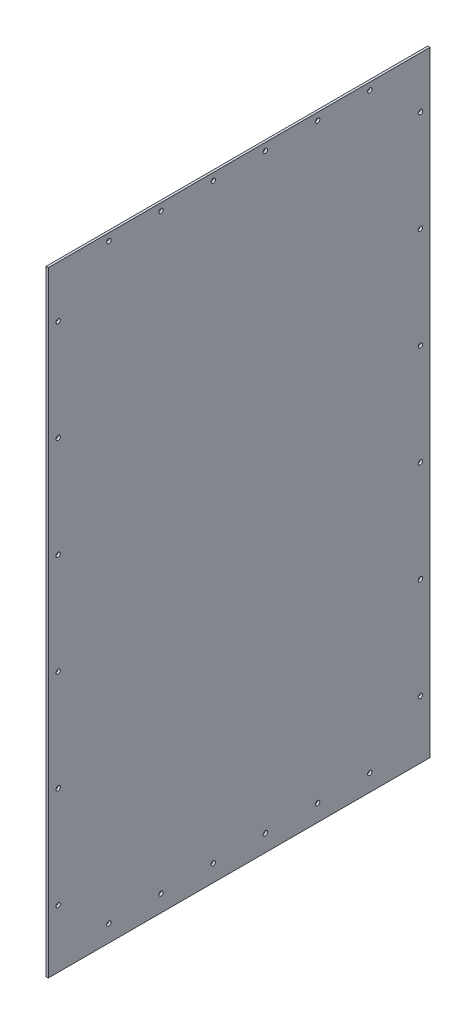
ISO-10303-21;
HEADER;
FILE_DESCRIPTION(('STEP AP214'),'2;1');
FILE_NAME('part.step','',(''),(''),'','','');
FILE_SCHEMA(('AUTOMOTIVE_DESIGN { 1 0 10303 214 1 1 1 1 }'));
ENDSEC;
DATA;
#1=APPLICATION_CONTEXT('core data for automotive mechanical design processes');
#2=APPLICATION_PROTOCOL_DEFINITION('international standard','automotive_design',2000,#1);
#3=PRODUCT_CONTEXT('',#1,'mechanical');
#4=PRODUCT('Part','Part','',(#3));
#5=PRODUCT_RELATED_PRODUCT_CATEGORY('part','',(#4));
#6=PRODUCT_DEFINITION_FORMATION('','',#4);
#7=PRODUCT_DEFINITION_CONTEXT('part definition',#1,'design');
#8=PRODUCT_DEFINITION('design','',#6,#7);
#9=PRODUCT_DEFINITION_SHAPE('','',#8);
#10=(LENGTH_UNIT() NAMED_UNIT(*) SI_UNIT(.MILLI.,.METRE.));
#11=(NAMED_UNIT(*) PLANE_ANGLE_UNIT() SI_UNIT($,.RADIAN.));
#12=(NAMED_UNIT(*) SI_UNIT($,.STERADIAN.) SOLID_ANGLE_UNIT());
#13=UNCERTAINTY_MEASURE_WITH_UNIT(LENGTH_MEASURE(1.E-05),#10,'distance_accuracy_value','');
#14=(GEOMETRIC_REPRESENTATION_CONTEXT(3) GLOBAL_UNCERTAINTY_ASSIGNED_CONTEXT((#13)) GLOBAL_UNIT_ASSIGNED_CONTEXT((#10,
#11,#12)) REPRESENTATION_CONTEXT('',''));
#15=CARTESIAN_POINT('',(0.,0.,0.));
#16=DIRECTION('',(0.,0.,1.));
#17=DIRECTION('',(1.,0.,0.));
#18=AXIS2_PLACEMENT_3D('',#15,#16,#17);
#19=CARTESIAN_POINT('',(0.,-328.2315,238.208299808));
#20=DIRECTION('',(1.,0.,0.));
#21=DIRECTION('',(0.,0.,-1.));
#22=AXIS2_PLACEMENT_3D('',#19,#20,#21);
#23=CYLINDRICAL_SURFACE('',#22,2.8956);
#24=CARTESIAN_POINT('',(0.,-328.2315,238.208299808));
#25=DIRECTION('',(1.,0.,0.));
#26=DIRECTION('',(0.,0.,-1.));
#27=AXIS2_PLACEMENT_3D('',#24,#25,#26);
#28=CIRCLE('',#27,2.8956);
#29=CARTESIAN_POINT('',(0.,-328.2315,235.312699808));
#30=VERTEX_POINT('',#29);
#31=EDGE_CURVE('E41',#30,#30,#28,.T.);
#32=ORIENTED_EDGE('',*,*,#31,.F.);
#33=EDGE_LOOP('',(#32));
#34=FACE_BOUND('',#33,.T.);
#35=CARTESIAN_POINT('',(3.0734,-328.2315,238.208299808));
#36=DIRECTION('',(1.,0.,0.));
#37=DIRECTION('',(0.,0.,-1.));
#38=AXIS2_PLACEMENT_3D('',#35,#36,#37);
#39=CIRCLE('',#38,2.8956);
#40=CARTESIAN_POINT('',(3.0734,-328.2315,235.312699808));
#41=VERTEX_POINT('',#40);
#42=EDGE_CURVE('E11',#41,#41,#39,.T.);
#43=ORIENTED_EDGE('',*,*,#42,.T.);
#44=EDGE_LOOP('',(#43));
#45=FACE_BOUND('',#44,.T.);
#46=ADVANCED_FACE('F33',(#34,#45),#23,.F.);
#47=CARTESIAN_POINT('',(0.,-195.09486,238.208299808));
#48=DIRECTION('',(1.,0.,0.));
#49=DIRECTION('',(0.,0.,-1.));
#50=AXIS2_PLACEMENT_3D('',#47,#48,#49);
#51=CYLINDRICAL_SURFACE('',#50,2.8956);
#52=CARTESIAN_POINT('',(0.,-195.09486,238.208299808));
#53=DIRECTION('',(1.,0.,0.));
#54=DIRECTION('',(0.,0.,-1.));
#55=AXIS2_PLACEMENT_3D('',#52,#53,#54);
#56=CIRCLE('',#55,2.8956);
#57=CARTESIAN_POINT('',(0.,-195.09486,235.312699808));
#58=VERTEX_POINT('',#57);
#59=EDGE_CURVE('E195',#58,#58,#56,.T.);
#60=ORIENTED_EDGE('',*,*,#59,.F.);
#61=EDGE_LOOP('',(#60));
#62=FACE_BOUND('',#61,.T.);
#63=CARTESIAN_POINT('',(3.0734,-195.09486,238.208299808));
#64=DIRECTION('',(1.,0.,0.));
#65=DIRECTION('',(0.,0.,-1.));
#66=AXIS2_PLACEMENT_3D('',#63,#64,#65);
#67=CIRCLE('',#66,2.8956);
#68=CARTESIAN_POINT('',(3.0734,-195.09486,235.312699808));
#69=VERTEX_POINT('',#68);
#70=EDGE_CURVE('E198',#69,#69,#67,.T.);
#71=ORIENTED_EDGE('',*,*,#70,.T.);
#72=EDGE_LOOP('',(#71));
#73=FACE_BOUND('',#72,.T.);
#74=ADVANCED_FACE('F207',(#62,#73),#51,.F.);
#75=CARTESIAN_POINT('',(0.,-61.95822,238.208299808));
#76=DIRECTION('',(1.,0.,0.));
#77=DIRECTION('',(0.,0.,-1.));
#78=AXIS2_PLACEMENT_3D('',#75,#76,#77);
#79=CYLINDRICAL_SURFACE('',#78,2.8956);
#80=CARTESIAN_POINT('',(0.,-61.95822,238.208299808));
#81=DIRECTION('',(1.,0.,0.));
#82=DIRECTION('',(0.,0.,-1.));
#83=AXIS2_PLACEMENT_3D('',#80,#81,#82);
#84=CIRCLE('',#83,2.8956);
#85=CARTESIAN_POINT('',(0.,-61.95822,235.312699808));
#86=VERTEX_POINT('',#85);
#87=EDGE_CURVE('E189',#86,#86,#84,.T.);
#88=ORIENTED_EDGE('',*,*,#87,.F.);
#89=EDGE_LOOP('',(#88));
#90=FACE_BOUND('',#89,.T.);
#91=CARTESIAN_POINT('',(3.0734,-61.95822,238.208299808));
#92=DIRECTION('',(1.,0.,0.));
#93=DIRECTION('',(0.,0.,-1.));
#94=AXIS2_PLACEMENT_3D('',#91,#92,#93);
#95=CIRCLE('',#94,2.8956);
#96=CARTESIAN_POINT('',(3.0734,-61.95822,235.312699808));
#97=VERTEX_POINT('',#96);
#98=EDGE_CURVE('E192',#97,#97,#95,.T.);
#99=ORIENTED_EDGE('',*,*,#98,.T.);
#100=EDGE_LOOP('',(#99));
#101=FACE_BOUND('',#100,.T.);
#102=ADVANCED_FACE('F286',(#90,#101),#79,.F.);
#103=CARTESIAN_POINT('',(0.,71.1784199999999,238.208299808));
#104=DIRECTION('',(1.,0.,0.));
#105=DIRECTION('',(0.,0.,-1.));
#106=AXIS2_PLACEMENT_3D('',#103,#104,#105);
#107=CYLINDRICAL_SURFACE('',#106,2.8956);
#108=CARTESIAN_POINT('',(0.,71.1784199999999,238.208299808));
#109=DIRECTION('',(1.,0.,0.));
#110=DIRECTION('',(0.,0.,-1.));
#111=AXIS2_PLACEMENT_3D('',#108,#109,#110);
#112=CIRCLE('',#111,2.8956);
#113=CARTESIAN_POINT('',(0.,71.1784199999999,235.312699808));
#114=VERTEX_POINT('',#113);
#115=EDGE_CURVE('E183',#114,#114,#112,.T.);
#116=ORIENTED_EDGE('',*,*,#115,.F.);
#117=EDGE_LOOP('',(#116));
#118=FACE_BOUND('',#117,.T.);
#119=CARTESIAN_POINT('',(3.0734,71.1784199999999,238.208299808));
#120=DIRECTION('',(1.,0.,0.));
#121=DIRECTION('',(0.,0.,-1.));
#122=AXIS2_PLACEMENT_3D('',#119,#120,#121);
#123=CIRCLE('',#122,2.8956);
#124=CARTESIAN_POINT('',(3.0734,71.1784199999999,235.312699808));
#125=VERTEX_POINT('',#124);
#126=EDGE_CURVE('E186',#125,#125,#123,.T.);
#127=ORIENTED_EDGE('',*,*,#126,.T.);
#128=EDGE_LOOP('',(#127));
#129=FACE_BOUND('',#128,.T.);
#130=ADVANCED_FACE('F282',(#118,#129),#107,.F.);
#131=CARTESIAN_POINT('',(0.,-328.2315,-238.5949));
#132=DIRECTION('',(1.,0.,0.));
#133=DIRECTION('',(0.,0.,-1.));
#134=AXIS2_PLACEMENT_3D('',#131,#132,#133);
#135=CYLINDRICAL_SURFACE('',#134,2.8956);
#136=CARTESIAN_POINT('',(0.,-328.2315,-238.5949));
#137=DIRECTION('',(1.,0.,0.));
#138=DIRECTION('',(0.,0.,-1.));
#139=AXIS2_PLACEMENT_3D('',#136,#137,#138);
#140=CIRCLE('',#139,2.8956);
#141=CARTESIAN_POINT('',(0.,-328.2315,-241.4905));
#142=VERTEX_POINT('',#141);
#143=EDGE_CURVE('E177',#142,#142,#140,.T.);
#144=ORIENTED_EDGE('',*,*,#143,.F.);
#145=EDGE_LOOP('',(#144));
#146=FACE_BOUND('',#145,.T.);
#147=CARTESIAN_POINT('',(3.0734,-328.2315,-238.5949));
#148=DIRECTION('',(1.,0.,0.));
#149=DIRECTION('',(0.,0.,-1.));
#150=AXIS2_PLACEMENT_3D('',#147,#148,#149);
#151=CIRCLE('',#150,2.8956);
#152=CARTESIAN_POINT('',(3.0734,-328.2315,-241.4905));
#153=VERTEX_POINT('',#152);
#154=EDGE_CURVE('E180',#153,#153,#151,.T.);
#155=ORIENTED_EDGE('',*,*,#154,.T.);
#156=EDGE_LOOP('',(#155));
#157=FACE_BOUND('',#156,.T.);
#158=ADVANCED_FACE('F278',(#146,#157),#135,.F.);
#159=CARTESIAN_POINT('',(0.,-195.09486,-238.5949));
#160=DIRECTION('',(1.,0.,0.));
#161=DIRECTION('',(0.,0.,-1.));
#162=AXIS2_PLACEMENT_3D('',#159,#160,#161);
#163=CYLINDRICAL_SURFACE('',#162,2.8956);
#164=CARTESIAN_POINT('',(0.,-195.09486,-238.5949));
#165=DIRECTION('',(1.,0.,0.));
#166=DIRECTION('',(0.,0.,-1.));
#167=AXIS2_PLACEMENT_3D('',#164,#165,#166);
#168=CIRCLE('',#167,2.8956);
#169=CARTESIAN_POINT('',(0.,-195.09486,-241.4905));
#170=VERTEX_POINT('',#169);
#171=EDGE_CURVE('E171',#170,#170,#168,.T.);
#172=ORIENTED_EDGE('',*,*,#171,.F.);
#173=EDGE_LOOP('',(#172));
#174=FACE_BOUND('',#173,.T.);
#175=CARTESIAN_POINT('',(3.0734,-195.09486,-238.5949));
#176=DIRECTION('',(1.,0.,0.));
#177=DIRECTION('',(0.,0.,-1.));
#178=AXIS2_PLACEMENT_3D('',#175,#176,#177);
#179=CIRCLE('',#178,2.8956);
#180=CARTESIAN_POINT('',(3.0734,-195.09486,-241.4905));
#181=VERTEX_POINT('',#180);
#182=EDGE_CURVE('E174',#181,#181,#179,.T.);
#183=ORIENTED_EDGE('',*,*,#182,.T.);
#184=EDGE_LOOP('',(#183));
#185=FACE_BOUND('',#184,.T.);
#186=ADVANCED_FACE('F274',(#174,#185),#163,.F.);
#187=CARTESIAN_POINT('',(0.,-61.95822,-238.5949));
#188=DIRECTION('',(1.,0.,0.));
#189=DIRECTION('',(0.,0.,-1.));
#190=AXIS2_PLACEMENT_3D('',#187,#188,#189);
#191=CYLINDRICAL_SURFACE('',#190,2.8956);
#192=CARTESIAN_POINT('',(0.,-61.95822,-238.5949));
#193=DIRECTION('',(1.,0.,0.));
#194=DIRECTION('',(0.,0.,-1.));
#195=AXIS2_PLACEMENT_3D('',#192,#193,#194);
#196=CIRCLE('',#195,2.8956);
#197=CARTESIAN_POINT('',(0.,-61.95822,-241.4905));
#198=VERTEX_POINT('',#197);
#199=EDGE_CURVE('E165',#198,#198,#196,.T.);
#200=ORIENTED_EDGE('',*,*,#199,.F.);
#201=EDGE_LOOP('',(#200));
#202=FACE_BOUND('',#201,.T.);
#203=CARTESIAN_POINT('',(3.0734,-61.95822,-238.5949));
#204=DIRECTION('',(1.,0.,0.));
#205=DIRECTION('',(0.,0.,-1.));
#206=AXIS2_PLACEMENT_3D('',#203,#204,#205);
#207=CIRCLE('',#206,2.8956);
#208=CARTESIAN_POINT('',(3.0734,-61.95822,-241.4905));
#209=VERTEX_POINT('',#208);
#210=EDGE_CURVE('E168',#209,#209,#207,.T.);
#211=ORIENTED_EDGE('',*,*,#210,.T.);
#212=EDGE_LOOP('',(#211));
#213=FACE_BOUND('',#212,.T.);
#214=ADVANCED_FACE('F270',(#202,#213),#191,.F.);
#215=CARTESIAN_POINT('',(0.,71.17842,-238.5949));
#216=DIRECTION('',(1.,0.,0.));
#217=DIRECTION('',(0.,0.,-1.));
#218=AXIS2_PLACEMENT_3D('',#215,#216,#217);
#219=CYLINDRICAL_SURFACE('',#218,2.8956);
#220=CARTESIAN_POINT('',(0.,71.17842,-238.5949));
#221=DIRECTION('',(1.,0.,0.));
#222=DIRECTION('',(0.,0.,-1.));
#223=AXIS2_PLACEMENT_3D('',#220,#221,#222);
#224=CIRCLE('',#223,2.8956);
#225=CARTESIAN_POINT('',(0.,71.17842,-241.4905));
#226=VERTEX_POINT('',#225);
#227=EDGE_CURVE('E159',#226,#226,#224,.T.);
#228=ORIENTED_EDGE('',*,*,#227,.F.);
#229=EDGE_LOOP('',(#228));
#230=FACE_BOUND('',#229,.T.);
#231=CARTESIAN_POINT('',(3.0734,71.17842,-238.5949));
#232=DIRECTION('',(1.,0.,0.));
#233=DIRECTION('',(0.,0.,-1.));
#234=AXIS2_PLACEMENT_3D('',#231,#232,#233);
#235=CIRCLE('',#234,2.8956);
#236=CARTESIAN_POINT('',(3.0734,71.17842,-241.4905));
#237=VERTEX_POINT('',#236);
#238=EDGE_CURVE('E162',#237,#237,#235,.T.);
#239=ORIENTED_EDGE('',*,*,#238,.T.);
#240=EDGE_LOOP('',(#239));
#241=FACE_BOUND('',#240,.T.);
#242=ADVANCED_FACE('F266',(#230,#241),#219,.F.);
#243=CARTESIAN_POINT('',(0.,395.3383,171.533299808));
#244=DIRECTION('',(1.,0.,0.));
#245=DIRECTION('',(0.,0.,-1.));
#246=AXIS2_PLACEMENT_3D('',#243,#244,#245);
#247=CYLINDRICAL_SURFACE('',#246,2.8956);
#248=CARTESIAN_POINT('',(0.,395.3383,171.533299808));
#249=DIRECTION('',(1.,0.,0.));
#250=DIRECTION('',(0.,0.,-1.));
#251=AXIS2_PLACEMENT_3D('',#248,#249,#250);
#252=CIRCLE('',#251,2.8956);
#253=CARTESIAN_POINT('',(0.,395.3383,168.637699808));
#254=VERTEX_POINT('',#253);
#255=EDGE_CURVE('E153',#254,#254,#252,.T.);
#256=ORIENTED_EDGE('',*,*,#255,.F.);
#257=EDGE_LOOP('',(#256));
#258=FACE_BOUND('',#257,.T.);
#259=CARTESIAN_POINT('',(3.0734,395.3383,171.533299808));
#260=DIRECTION('',(1.,0.,0.));
#261=DIRECTION('',(0.,0.,-1.));
#262=AXIS2_PLACEMENT_3D('',#259,#260,#261);
#263=CIRCLE('',#262,2.8956);
#264=CARTESIAN_POINT('',(3.0734,395.3383,168.637699808));
#265=VERTEX_POINT('',#264);
#266=EDGE_CURVE('E156',#265,#265,#263,.T.);
#267=ORIENTED_EDGE('',*,*,#266,.T.);
#268=EDGE_LOOP('',(#267));
#269=FACE_BOUND('',#268,.T.);
#270=ADVANCED_FACE('F262',(#258,#269),#247,.F.);
#271=CARTESIAN_POINT('',(0.,395.3383,102.8426598464));
#272=DIRECTION('',(1.,0.,0.));
#273=DIRECTION('',(0.,0.,-1.));
#274=AXIS2_PLACEMENT_3D('',#271,#272,#273);
#275=CYLINDRICAL_SURFACE('',#274,2.8956);
#276=CARTESIAN_POINT('',(0.,395.3383,102.8426598464));
#277=DIRECTION('',(1.,0.,0.));
#278=DIRECTION('',(0.,0.,-1.));
#279=AXIS2_PLACEMENT_3D('',#276,#277,#278);
#280=CIRCLE('',#279,2.8956);
#281=CARTESIAN_POINT('',(0.,395.3383,99.9470598464001));
#282=VERTEX_POINT('',#281);
#283=EDGE_CURVE('E147',#282,#282,#280,.T.);
#284=ORIENTED_EDGE('',*,*,#283,.F.);
#285=EDGE_LOOP('',(#284));
#286=FACE_BOUND('',#285,.T.);
#287=CARTESIAN_POINT('',(3.0734,395.3383,102.8426598464));
#288=DIRECTION('',(1.,0.,0.));
#289=DIRECTION('',(0.,0.,-1.));
#290=AXIS2_PLACEMENT_3D('',#287,#288,#289);
#291=CIRCLE('',#290,2.8956);
#292=CARTESIAN_POINT('',(3.0734,395.3383,99.9470598464001));
#293=VERTEX_POINT('',#292);
#294=EDGE_CURVE('E150',#293,#293,#291,.T.);
#295=ORIENTED_EDGE('',*,*,#294,.T.);
#296=EDGE_LOOP('',(#295));
#297=FACE_BOUND('',#296,.T.);
#298=ADVANCED_FACE('F258',(#286,#297),#275,.F.);
#299=CARTESIAN_POINT('',(0.,395.3383,34.1520198848));
#300=DIRECTION('',(1.,0.,0.));
#301=DIRECTION('',(0.,0.,-1.));
#302=AXIS2_PLACEMENT_3D('',#299,#300,#301);
#303=CYLINDRICAL_SURFACE('',#302,2.8956);
#304=CARTESIAN_POINT('',(0.,395.3383,34.1520198848));
#305=DIRECTION('',(1.,0.,0.));
#306=DIRECTION('',(0.,0.,-1.));
#307=AXIS2_PLACEMENT_3D('',#304,#305,#306);
#308=CIRCLE('',#307,2.8956);
#309=CARTESIAN_POINT('',(0.,395.3383,31.2564198848));
#310=VERTEX_POINT('',#309);
#311=EDGE_CURVE('E141',#310,#310,#308,.T.);
#312=ORIENTED_EDGE('',*,*,#311,.F.);
#313=EDGE_LOOP('',(#312));
#314=FACE_BOUND('',#313,.T.);
#315=CARTESIAN_POINT('',(3.0734,395.3383,34.1520198848));
#316=DIRECTION('',(1.,0.,0.));
#317=DIRECTION('',(0.,0.,-1.));
#318=AXIS2_PLACEMENT_3D('',#315,#316,#317);
#319=CIRCLE('',#318,2.8956);
#320=CARTESIAN_POINT('',(3.0734,395.3383,31.2564198848));
#321=VERTEX_POINT('',#320);
#322=EDGE_CURVE('E144',#321,#321,#319,.T.);
#323=ORIENTED_EDGE('',*,*,#322,.T.);
#324=EDGE_LOOP('',(#323));
#325=FACE_BOUND('',#324,.T.);
#326=ADVANCED_FACE('F254',(#314,#325),#303,.F.);
#327=CARTESIAN_POINT('',(0.,395.3383,-34.5386200768));
#328=DIRECTION('',(1.,0.,0.));
#329=DIRECTION('',(0.,0.,-1.));
#330=AXIS2_PLACEMENT_3D('',#327,#328,#329);
#331=CYLINDRICAL_SURFACE('',#330,2.8956);
#332=CARTESIAN_POINT('',(0.,395.3383,-34.5386200768));
#333=DIRECTION('',(1.,0.,0.));
#334=DIRECTION('',(0.,0.,-1.));
#335=AXIS2_PLACEMENT_3D('',#332,#333,#334);
#336=CIRCLE('',#335,2.8956);
#337=CARTESIAN_POINT('',(0.,395.3383,-37.4342200768));
#338=VERTEX_POINT('',#337);
#339=EDGE_CURVE('E135',#338,#338,#336,.T.);
#340=ORIENTED_EDGE('',*,*,#339,.F.);
#341=EDGE_LOOP('',(#340));
#342=FACE_BOUND('',#341,.T.);
#343=CARTESIAN_POINT('',(3.0734,395.3383,-34.5386200768));
#344=DIRECTION('',(1.,0.,0.));
#345=DIRECTION('',(0.,0.,-1.));
#346=AXIS2_PLACEMENT_3D('',#343,#344,#345);
#347=CIRCLE('',#346,2.8956);
#348=CARTESIAN_POINT('',(3.0734,395.3383,-37.4342200768));
#349=VERTEX_POINT('',#348);
#350=EDGE_CURVE('E138',#349,#349,#347,.T.);
#351=ORIENTED_EDGE('',*,*,#350,.T.);
#352=EDGE_LOOP('',(#351));
#353=FACE_BOUND('',#352,.T.);
#354=ADVANCED_FACE('F250',(#342,#353),#331,.F.);
#355=CARTESIAN_POINT('',(0.,-382.6383,171.533299808));
#356=DIRECTION('',(1.,0.,0.));
#357=DIRECTION('',(0.,0.,-1.));
#358=AXIS2_PLACEMENT_3D('',#355,#356,#357);
#359=CYLINDRICAL_SURFACE('',#358,2.8956);
#360=CARTESIAN_POINT('',(0.,-382.6383,171.533299808));
#361=DIRECTION('',(1.,0.,0.));
#362=DIRECTION('',(0.,0.,-1.));
#363=AXIS2_PLACEMENT_3D('',#360,#361,#362);
#364=CIRCLE('',#363,2.8956);
#365=CARTESIAN_POINT('',(0.,-382.6383,168.637699808));
#366=VERTEX_POINT('',#365);
#367=EDGE_CURVE('E129',#366,#366,#364,.T.);
#368=ORIENTED_EDGE('',*,*,#367,.F.);
#369=EDGE_LOOP('',(#368));
#370=FACE_BOUND('',#369,.T.);
#371=CARTESIAN_POINT('',(3.0734,-382.6383,171.533299808));
#372=DIRECTION('',(1.,0.,0.));
#373=DIRECTION('',(0.,0.,-1.));
#374=AXIS2_PLACEMENT_3D('',#371,#372,#373);
#375=CIRCLE('',#374,2.8956);
#376=CARTESIAN_POINT('',(3.0734,-382.6383,168.637699808));
#377=VERTEX_POINT('',#376);
#378=EDGE_CURVE('E132',#377,#377,#375,.T.);
#379=ORIENTED_EDGE('',*,*,#378,.T.);
#380=EDGE_LOOP('',(#379));
#381=FACE_BOUND('',#380,.T.);
#382=ADVANCED_FACE('F246',(#370,#381),#359,.F.);
#383=CARTESIAN_POINT('',(0.,-382.6383,102.8426598464));
#384=DIRECTION('',(1.,0.,0.));
#385=DIRECTION('',(0.,0.,-1.));
#386=AXIS2_PLACEMENT_3D('',#383,#384,#385);
#387=CYLINDRICAL_SURFACE('',#386,2.8956);
#388=CARTESIAN_POINT('',(0.,-382.6383,102.8426598464));
#389=DIRECTION('',(1.,0.,0.));
#390=DIRECTION('',(0.,0.,-1.));
#391=AXIS2_PLACEMENT_3D('',#388,#389,#390);
#392=CIRCLE('',#391,2.8956);
#393=CARTESIAN_POINT('',(0.,-382.6383,99.9470598464));
#394=VERTEX_POINT('',#393);
#395=EDGE_CURVE('E123',#394,#394,#392,.T.);
#396=ORIENTED_EDGE('',*,*,#395,.F.);
#397=EDGE_LOOP('',(#396));
#398=FACE_BOUND('',#397,.T.);
#399=CARTESIAN_POINT('',(3.0734,-382.6383,102.8426598464));
#400=DIRECTION('',(1.,0.,0.));
#401=DIRECTION('',(0.,0.,-1.));
#402=AXIS2_PLACEMENT_3D('',#399,#400,#401);
#403=CIRCLE('',#402,2.8956);
#404=CARTESIAN_POINT('',(3.0734,-382.6383,99.9470598464));
#405=VERTEX_POINT('',#404);
#406=EDGE_CURVE('E126',#405,#405,#403,.T.);
#407=ORIENTED_EDGE('',*,*,#406,.T.);
#408=EDGE_LOOP('',(#407));
#409=FACE_BOUND('',#408,.T.);
#410=ADVANCED_FACE('F242',(#398,#409),#387,.F.);
#411=CARTESIAN_POINT('',(0.,-382.6383,34.1520198847999));
#412=DIRECTION('',(1.,0.,0.));
#413=DIRECTION('',(0.,0.,-1.));
#414=AXIS2_PLACEMENT_3D('',#411,#412,#413);
#415=CYLINDRICAL_SURFACE('',#414,2.8956);
#416=CARTESIAN_POINT('',(0.,-382.6383,34.1520198847999));
#417=DIRECTION('',(1.,0.,0.));
#418=DIRECTION('',(0.,0.,-1.));
#419=AXIS2_PLACEMENT_3D('',#416,#417,#418);
#420=CIRCLE('',#419,2.8956);
#421=CARTESIAN_POINT('',(0.,-382.6383,31.2564198847999));
#422=VERTEX_POINT('',#421);
#423=EDGE_CURVE('E117',#422,#422,#420,.T.);
#424=ORIENTED_EDGE('',*,*,#423,.F.);
#425=EDGE_LOOP('',(#424));
#426=FACE_BOUND('',#425,.T.);
#427=CARTESIAN_POINT('',(3.0734,-382.6383,34.1520198847999));
#428=DIRECTION('',(1.,0.,0.));
#429=DIRECTION('',(0.,0.,-1.));
#430=AXIS2_PLACEMENT_3D('',#427,#428,#429);
#431=CIRCLE('',#430,2.8956);
#432=CARTESIAN_POINT('',(3.0734,-382.6383,31.2564198847999));
#433=VERTEX_POINT('',#432);
#434=EDGE_CURVE('E120',#433,#433,#431,.T.);
#435=ORIENTED_EDGE('',*,*,#434,.T.);
#436=EDGE_LOOP('',(#435));
#437=FACE_BOUND('',#436,.T.);
#438=ADVANCED_FACE('F238',(#426,#437),#415,.F.);
#439=CARTESIAN_POINT('',(0.,-382.6383,-34.5386200768001));
#440=DIRECTION('',(1.,0.,0.));
#441=DIRECTION('',(0.,0.,-1.));
#442=AXIS2_PLACEMENT_3D('',#439,#440,#441);
#443=CYLINDRICAL_SURFACE('',#442,2.8956);
#444=CARTESIAN_POINT('',(0.,-382.6383,-34.5386200768001));
#445=DIRECTION('',(1.,0.,0.));
#446=DIRECTION('',(0.,0.,-1.));
#447=AXIS2_PLACEMENT_3D('',#444,#445,#446);
#448=CIRCLE('',#447,2.8956);
#449=CARTESIAN_POINT('',(0.,-382.6383,-37.4342200768001));
#450=VERTEX_POINT('',#449);
#451=EDGE_CURVE('E111',#450,#450,#448,.T.);
#452=ORIENTED_EDGE('',*,*,#451,.F.);
#453=EDGE_LOOP('',(#452));
#454=FACE_BOUND('',#453,.T.);
#455=CARTESIAN_POINT('',(3.0734,-382.6383,-34.5386200768001));
#456=DIRECTION('',(1.,0.,0.));
#457=DIRECTION('',(0.,0.,-1.));
#458=AXIS2_PLACEMENT_3D('',#455,#456,#457);
#459=CIRCLE('',#458,2.8956);
#460=CARTESIAN_POINT('',(3.0734,-382.6383,-37.4342200768001));
#461=VERTEX_POINT('',#460);
#462=EDGE_CURVE('E114',#461,#461,#459,.T.);
#463=ORIENTED_EDGE('',*,*,#462,.T.);
#464=EDGE_LOOP('',(#463));
#465=FACE_BOUND('',#464,.T.);
#466=ADVANCED_FACE('F234',(#454,#465),#443,.F.);
#467=CARTESIAN_POINT('',(3.0734,-404.8633,251.1933));
#468=DIRECTION('',(0.,0.,-1.));
#469=DIRECTION('',(-1.,0.,0.));
#470=AXIS2_PLACEMENT_3D('',#467,#468,#469);
#471=PLANE('',#470);
#472=DIRECTION('',(0.,-1.,0.));
#473=VECTOR('',#472,1.);
#474=CARTESIAN_POINT('',(0.,-404.8633,251.1933));
#475=LINE('',#474,#473);
#476=CARTESIAN_POINT('',(0.,404.8633,251.1933));
#477=VERTEX_POINT('',#476);
#478=CARTESIAN_POINT('',(0.,-404.8633,251.1933));
#479=VERTEX_POINT('',#478);
#480=EDGE_CURVE('E101',#477,#479,#475,.T.);
#481=ORIENTED_EDGE('',*,*,#480,.T.);
#482=DIRECTION('',(-1.,0.,0.));
#483=VECTOR('',#482,1.);
#484=CARTESIAN_POINT('',(3.0734,-404.8633,251.1933));
#485=LINE('',#484,#483);
#486=CARTESIAN_POINT('',(3.0734,-404.8633,251.1933));
#487=VERTEX_POINT('',#486);
#488=EDGE_CURVE('E92',#487,#479,#485,.T.);
#489=ORIENTED_EDGE('',*,*,#488,.F.);
#490=DIRECTION('',(0.,-1.,0.));
#491=VECTOR('',#490,1.);
#492=CARTESIAN_POINT('',(3.0734,-404.8633,251.1933));
#493=LINE('',#492,#491);
#494=CARTESIAN_POINT('',(3.0734,404.8633,251.1933));
#495=VERTEX_POINT('',#494);
#496=EDGE_CURVE('E86',#495,#487,#493,.T.);
#497=ORIENTED_EDGE('',*,*,#496,.F.);
#498=DIRECTION('',(-1.,0.,0.));
#499=VECTOR('',#498,1.);
#500=CARTESIAN_POINT('',(3.0734,404.8633,251.1933));
#501=LINE('',#500,#499);
#502=EDGE_CURVE('E97',#495,#477,#501,.T.);
#503=ORIENTED_EDGE('',*,*,#502,.T.);
#504=EDGE_LOOP('',(#481,#489,#497,#503));
#505=FACE_BOUND('',#504,.T.);
#506=ADVANCED_FACE('F231',(#505),#471,.F.);
#507=CARTESIAN_POINT('',(3.0734,-404.8633,-251.1933));
#508=DIRECTION('',(0.,1.,0.));
#509=DIRECTION('',(0.,0.,1.));
#510=AXIS2_PLACEMENT_3D('',#507,#508,#509);
#511=PLANE('',#510);
#512=DIRECTION('',(0.,0.,-1.));
#513=VECTOR('',#512,1.);
#514=CARTESIAN_POINT('',(0.,-404.8633,-251.1933));
#515=LINE('',#514,#513);
#516=CARTESIAN_POINT('',(0.,-404.8633,-251.1933));
#517=VERTEX_POINT('',#516);
#518=EDGE_CURVE('E91',#479,#517,#515,.T.);
#519=ORIENTED_EDGE('',*,*,#518,.T.);
#520=DIRECTION('',(-1.,0.,0.));
#521=VECTOR('',#520,1.);
#522=CARTESIAN_POINT('',(3.0734,-404.8633,-251.1933));
#523=LINE('',#522,#521);
#524=CARTESIAN_POINT('',(3.0734,-404.8633,-251.1933));
#525=VERTEX_POINT('',#524);
#526=EDGE_CURVE('E89',#525,#517,#523,.T.);
#527=ORIENTED_EDGE('',*,*,#526,.F.);
#528=DIRECTION('',(0.,0.,-1.));
#529=VECTOR('',#528,1.);
#530=CARTESIAN_POINT('',(3.0734,-404.8633,-251.1933));
#531=LINE('',#530,#529);
#532=EDGE_CURVE('E80',#487,#525,#531,.T.);
#533=ORIENTED_EDGE('',*,*,#532,.F.);
#534=ORIENTED_EDGE('',*,*,#488,.T.);
#535=EDGE_LOOP('',(#519,#527,#533,#534));
#536=FACE_BOUND('',#535,.T.);
#537=ADVANCED_FACE('F90',(#536),#511,.F.);
#538=CARTESIAN_POINT('',(3.0734,-404.8633,-251.1933));
#539=DIRECTION('',(0.,0.,1.));
#540=DIRECTION('',(1.,0.,0.));
#541=AXIS2_PLACEMENT_3D('',#538,#539,#540);
#542=PLANE('',#541);
#543=DIRECTION('',(0.,1.,0.));
#544=VECTOR('',#543,1.);
#545=CARTESIAN_POINT('',(0.,-404.8633,-251.1933));
#546=LINE('',#545,#544);
#547=CARTESIAN_POINT('',(0.,404.8633,-251.1933));
#548=VERTEX_POINT('',#547);
#549=EDGE_CURVE('E66',#517,#548,#546,.T.);
#550=ORIENTED_EDGE('',*,*,#549,.T.);
#551=DIRECTION('',(-1.,0.,0.));
#552=VECTOR('',#551,1.);
#553=CARTESIAN_POINT('',(3.0734,404.8633,-251.1933));
#554=LINE('',#553,#552);
#555=CARTESIAN_POINT('',(3.0734,404.8633,-251.1933));
#556=VERTEX_POINT('',#555);
#557=EDGE_CURVE('E93',#556,#548,#554,.T.);
#558=ORIENTED_EDGE('',*,*,#557,.F.);
#559=DIRECTION('',(0.,1.,0.));
#560=VECTOR('',#559,1.);
#561=CARTESIAN_POINT('',(3.0734,-404.8633,-251.1933));
#562=LINE('',#561,#560);
#563=EDGE_CURVE('E84',#525,#556,#562,.T.);
#564=ORIENTED_EDGE('',*,*,#563,.F.);
#565=ORIENTED_EDGE('',*,*,#526,.T.);
#566=EDGE_LOOP('',(#550,#558,#564,#565));
#567=FACE_BOUND('',#566,.T.);
#568=ADVANCED_FACE('F95',(#567),#542,.F.);
#569=CARTESIAN_POINT('',(3.0734,404.8633,-251.1933));
#570=DIRECTION('',(0.,-1.,0.));
#571=DIRECTION('',(0.,0.,-1.));
#572=AXIS2_PLACEMENT_3D('',#569,#570,#571);
#573=PLANE('',#572);
#574=DIRECTION('',(0.,0.,1.));
#575=VECTOR('',#574,1.);
#576=CARTESIAN_POINT('',(0.,404.8633,-251.1933));
#577=LINE('',#576,#575);
#578=EDGE_CURVE('E72',#548,#477,#577,.T.);
#579=ORIENTED_EDGE('',*,*,#578,.T.);
#580=ORIENTED_EDGE('',*,*,#502,.F.);
#581=DIRECTION('',(0.,0.,1.));
#582=VECTOR('',#581,1.);
#583=CARTESIAN_POINT('',(3.0734,404.8633,-251.1933));
#584=LINE('',#583,#582);
#585=EDGE_CURVE('E49',#556,#495,#584,.T.);
#586=ORIENTED_EDGE('',*,*,#585,.F.);
#587=ORIENTED_EDGE('',*,*,#557,.T.);
#588=EDGE_LOOP('',(#579,#580,#586,#587));
#589=FACE_BOUND('',#588,.T.);
#590=ADVANCED_FACE('F211',(#589),#573,.F.);
#591=CARTESIAN_POINT('',(3.0734,0.,0.));
#592=DIRECTION('',(1.,0.,0.));
#593=DIRECTION('',(0.,0.,-1.));
#594=AXIS2_PLACEMENT_3D('',#591,#592,#593);
#595=PLANE('',#594);
#596=CARTESIAN_POINT('',(3.0734,204.31506,238.208299808));
#597=DIRECTION('',(1.,0.,0.));
#598=DIRECTION('',(0.,0.,-1.));
#599=AXIS2_PLACEMENT_3D('',#596,#597,#598);
#600=CIRCLE('',#599,2.8956);
#601=CARTESIAN_POINT('',(3.0734,204.31506,235.312699808));
#602=VERTEX_POINT('',#601);
#603=EDGE_CURVE('E496',#602,#602,#600,.T.);
#604=ORIENTED_EDGE('',*,*,#603,.F.);
#605=EDGE_LOOP('',(#604));
#606=FACE_BOUND('',#605,.T.);
#607=CARTESIAN_POINT('',(3.0734,204.31506,-238.5949));
#608=DIRECTION('',(1.,0.,0.));
#609=DIRECTION('',(0.,0.,-1.));
#610=AXIS2_PLACEMENT_3D('',#607,#608,#609);
#611=CIRCLE('',#610,2.8956);
#612=CARTESIAN_POINT('',(3.0734,204.31506,-241.4905));
#613=VERTEX_POINT('',#612);
#614=EDGE_CURVE('E500',#613,#613,#611,.T.);
#615=ORIENTED_EDGE('',*,*,#614,.F.);
#616=EDGE_LOOP('',(#615));
#617=FACE_BOUND('',#616,.T.);
#618=CARTESIAN_POINT('',(3.0734,337.4517,-238.5949));
#619=DIRECTION('',(1.,0.,0.));
#620=DIRECTION('',(0.,0.,-1.));
#621=AXIS2_PLACEMENT_3D('',#618,#619,#620);
#622=CIRCLE('',#621,2.8956);
#623=CARTESIAN_POINT('',(3.0734,337.4517,-241.4905));
#624=VERTEX_POINT('',#623);
#625=EDGE_CURVE('E506',#624,#624,#622,.T.);
#626=ORIENTED_EDGE('',*,*,#625,.F.);
#627=EDGE_LOOP('',(#626));
#628=FACE_BOUND('',#627,.T.);
#629=CARTESIAN_POINT('',(3.0734,337.4517,238.208299808));
#630=DIRECTION('',(1.,0.,0.));
#631=DIRECTION('',(0.,0.,-1.));
#632=AXIS2_PLACEMENT_3D('',#629,#630,#631);
#633=CIRCLE('',#632,2.8956);
#634=CARTESIAN_POINT('',(3.0734,337.4517,235.312699808));
#635=VERTEX_POINT('',#634);
#636=EDGE_CURVE('E510',#635,#635,#633,.T.);
#637=ORIENTED_EDGE('',*,*,#636,.F.);
#638=EDGE_LOOP('',(#637));
#639=FACE_BOUND('',#638,.T.);
#640=CARTESIAN_POINT('',(3.0734,395.3383,-103.2292600384));
#641=DIRECTION('',(1.,0.,0.));
#642=DIRECTION('',(0.,0.,-1.));
#643=AXIS2_PLACEMENT_3D('',#640,#641,#642);
#644=CIRCLE('',#643,2.8956);
#645=CARTESIAN_POINT('',(3.0734,395.3383,-106.1248600384));
#646=VERTEX_POINT('',#645);
#647=EDGE_CURVE('E521',#646,#646,#644,.T.);
#648=ORIENTED_EDGE('',*,*,#647,.F.);
#649=EDGE_LOOP('',(#648));
#650=FACE_BOUND('',#649,.T.);
#651=CARTESIAN_POINT('',(3.0734,-382.6383,-103.2292600384));
#652=DIRECTION('',(1.,0.,0.));
#653=DIRECTION('',(0.,0.,-1.));
#654=AXIS2_PLACEMENT_3D('',#651,#652,#653);
#655=CIRCLE('',#654,2.8956);
#656=CARTESIAN_POINT('',(3.0734,-382.6383,-106.1248600384));
#657=VERTEX_POINT('',#656);
#658=EDGE_CURVE('E527',#657,#657,#655,.T.);
#659=ORIENTED_EDGE('',*,*,#658,.F.);
#660=EDGE_LOOP('',(#659));
#661=FACE_BOUND('',#660,.T.);
#662=CARTESIAN_POINT('',(3.0734,-382.6383,-171.9199));
#663=DIRECTION('',(1.,0.,0.));
#664=DIRECTION('',(0.,0.,-1.));
#665=AXIS2_PLACEMENT_3D('',#662,#663,#664);
#666=CIRCLE('',#665,2.8956);
#667=CARTESIAN_POINT('',(3.0734,-382.6383,-174.8155));
#668=VERTEX_POINT('',#667);
#669=EDGE_CURVE('E530',#668,#668,#666,.T.);
#670=ORIENTED_EDGE('',*,*,#669,.F.);
#671=EDGE_LOOP('',(#670));
#672=FACE_BOUND('',#671,.T.);
#673=CARTESIAN_POINT('',(3.0734,395.3383,-171.9199));
#674=DIRECTION('',(1.,0.,0.));
#675=DIRECTION('',(0.,0.,-1.));
#676=AXIS2_PLACEMENT_3D('',#673,#674,#675);
#677=CIRCLE('',#676,2.8956);
#678=CARTESIAN_POINT('',(3.0734,395.3383,-174.8155));
#679=VERTEX_POINT('',#678);
#680=EDGE_CURVE('E534',#679,#679,#677,.T.);
#681=ORIENTED_EDGE('',*,*,#680,.F.);
#682=EDGE_LOOP('',(#681));
#683=FACE_BOUND('',#682,.T.);
#684=ORIENTED_EDGE('',*,*,#496,.T.);
#685=ORIENTED_EDGE('',*,*,#532,.T.);
#686=ORIENTED_EDGE('',*,*,#563,.T.);
#687=ORIENTED_EDGE('',*,*,#585,.T.);
#688=EDGE_LOOP('',(#684,#685,#686,#687));
#689=FACE_BOUND('',#688,.T.);
#690=ORIENTED_EDGE('',*,*,#462,.F.);
#691=EDGE_LOOP('',(#690));
#692=FACE_BOUND('',#691,.T.);
#693=ORIENTED_EDGE('',*,*,#434,.F.);
#694=EDGE_LOOP('',(#693));
#695=FACE_BOUND('',#694,.T.);
#696=ORIENTED_EDGE('',*,*,#406,.F.);
#697=EDGE_LOOP('',(#696));
#698=FACE_BOUND('',#697,.T.);
#699=ORIENTED_EDGE('',*,*,#378,.F.);
#700=EDGE_LOOP('',(#699));
#701=FACE_BOUND('',#700,.T.);
#702=ORIENTED_EDGE('',*,*,#350,.F.);
#703=EDGE_LOOP('',(#702));
#704=FACE_BOUND('',#703,.T.);
#705=ORIENTED_EDGE('',*,*,#322,.F.);
#706=EDGE_LOOP('',(#705));
#707=FACE_BOUND('',#706,.T.);
#708=ORIENTED_EDGE('',*,*,#294,.F.);
#709=EDGE_LOOP('',(#708));
#710=FACE_BOUND('',#709,.T.);
#711=ORIENTED_EDGE('',*,*,#266,.F.);
#712=EDGE_LOOP('',(#711));
#713=FACE_BOUND('',#712,.T.);
#714=ORIENTED_EDGE('',*,*,#238,.F.);
#715=EDGE_LOOP('',(#714));
#716=FACE_BOUND('',#715,.T.);
#717=ORIENTED_EDGE('',*,*,#210,.F.);
#718=EDGE_LOOP('',(#717));
#719=FACE_BOUND('',#718,.T.);
#720=ORIENTED_EDGE('',*,*,#182,.F.);
#721=EDGE_LOOP('',(#720));
#722=FACE_BOUND('',#721,.T.);
#723=ORIENTED_EDGE('',*,*,#154,.F.);
#724=EDGE_LOOP('',(#723));
#725=FACE_BOUND('',#724,.T.);
#726=ORIENTED_EDGE('',*,*,#126,.F.);
#727=EDGE_LOOP('',(#726));
#728=FACE_BOUND('',#727,.T.);
#729=ORIENTED_EDGE('',*,*,#98,.F.);
#730=EDGE_LOOP('',(#729));
#731=FACE_BOUND('',#730,.T.);
#732=ORIENTED_EDGE('',*,*,#70,.F.);
#733=EDGE_LOOP('',(#732));
#734=FACE_BOUND('',#733,.T.);
#735=ORIENTED_EDGE('',*,*,#42,.F.);
#736=EDGE_LOOP('',(#735));
#737=FACE_BOUND('',#736,.T.);
#738=ADVANCED_FACE('F81',(#606,#617,#628,#639,#650,#661,#672,#683,#689,#692,#695,#698,#701,#704,
#707,#710,#713,#716,#719,#722,#725,#728,#731,#734,#737),#595,.T.);
#739=CARTESIAN_POINT('',(0.,0.,0.));
#740=DIRECTION('',(1.,0.,0.));
#741=DIRECTION('',(0.,0.,-1.));
#742=AXIS2_PLACEMENT_3D('',#739,#740,#741);
#743=PLANE('',#742);
#744=CARTESIAN_POINT('',(0.,204.31506,238.208299808));
#745=DIRECTION('',(1.,0.,0.));
#746=DIRECTION('',(0.,0.,-1.));
#747=AXIS2_PLACEMENT_3D('',#744,#745,#746);
#748=CIRCLE('',#747,2.8956);
#749=CARTESIAN_POINT('',(0.,204.31506,235.312699808));
#750=VERTEX_POINT('',#749);
#751=EDGE_CURVE('E494',#750,#750,#748,.T.);
#752=ORIENTED_EDGE('',*,*,#751,.T.);
#753=EDGE_LOOP('',(#752));
#754=FACE_BOUND('',#753,.T.);
#755=CARTESIAN_POINT('',(0.,204.31506,-238.5949));
#756=DIRECTION('',(1.,0.,0.));
#757=DIRECTION('',(0.,0.,-1.));
#758=AXIS2_PLACEMENT_3D('',#755,#756,#757);
#759=CIRCLE('',#758,2.8956);
#760=CARTESIAN_POINT('',(0.,204.31506,-241.4905));
#761=VERTEX_POINT('',#760);
#762=EDGE_CURVE('E497',#761,#761,#759,.T.);
#763=ORIENTED_EDGE('',*,*,#762,.T.);
#764=EDGE_LOOP('',(#763));
#765=FACE_BOUND('',#764,.T.);
#766=CARTESIAN_POINT('',(0.,337.4517,-238.5949));
#767=DIRECTION('',(1.,0.,0.));
#768=DIRECTION('',(0.,0.,-1.));
#769=AXIS2_PLACEMENT_3D('',#766,#767,#768);
#770=CIRCLE('',#769,2.8956);
#771=CARTESIAN_POINT('',(0.,337.4517,-241.4905));
#772=VERTEX_POINT('',#771);
#773=EDGE_CURVE('E507',#772,#772,#770,.T.);
#774=ORIENTED_EDGE('',*,*,#773,.T.);
#775=EDGE_LOOP('',(#774));
#776=FACE_BOUND('',#775,.T.);
#777=CARTESIAN_POINT('',(0.,337.4517,238.208299808));
#778=DIRECTION('',(1.,0.,0.));
#779=DIRECTION('',(0.,0.,-1.));
#780=AXIS2_PLACEMENT_3D('',#777,#778,#779);
#781=CIRCLE('',#780,2.8956);
#782=CARTESIAN_POINT('',(0.,337.4517,235.312699808));
#783=VERTEX_POINT('',#782);
#784=EDGE_CURVE('E513',#783,#783,#781,.T.);
#785=ORIENTED_EDGE('',*,*,#784,.T.);
#786=EDGE_LOOP('',(#785));
#787=FACE_BOUND('',#786,.T.);
#788=CARTESIAN_POINT('',(0.,395.3383,-103.2292600384));
#789=DIRECTION('',(1.,0.,0.));
#790=DIRECTION('',(0.,0.,-1.));
#791=AXIS2_PLACEMENT_3D('',#788,#789,#790);
#792=CIRCLE('',#791,2.8956);
#793=CARTESIAN_POINT('',(0.,395.3383,-106.1248600384));
#794=VERTEX_POINT('',#793);
#795=EDGE_CURVE('E516',#794,#794,#792,.T.);
#796=ORIENTED_EDGE('',*,*,#795,.T.);
#797=EDGE_LOOP('',(#796));
#798=FACE_BOUND('',#797,.T.);
#799=CARTESIAN_POINT('',(0.,-382.6383,-103.2292600384));
#800=DIRECTION('',(1.,0.,0.));
#801=DIRECTION('',(0.,0.,-1.));
#802=AXIS2_PLACEMENT_3D('',#799,#800,#801);
#803=CIRCLE('',#802,2.8956);
#804=CARTESIAN_POINT('',(0.,-382.6383,-106.1248600384));
#805=VERTEX_POINT('',#804);
#806=EDGE_CURVE('E524',#805,#805,#803,.T.);
#807=ORIENTED_EDGE('',*,*,#806,.T.);
#808=EDGE_LOOP('',(#807));
#809=FACE_BOUND('',#808,.T.);
#810=CARTESIAN_POINT('',(0.,-382.6383,-171.9199));
#811=DIRECTION('',(1.,0.,0.));
#812=DIRECTION('',(0.,0.,-1.));
#813=AXIS2_PLACEMENT_3D('',#810,#811,#812);
#814=CIRCLE('',#813,2.8956);
#815=CARTESIAN_POINT('',(0.,-382.6383,-174.8155));
#816=VERTEX_POINT('',#815);
#817=EDGE_CURVE('E531',#816,#816,#814,.T.);
#818=ORIENTED_EDGE('',*,*,#817,.T.);
#819=EDGE_LOOP('',(#818));
#820=FACE_BOUND('',#819,.T.);
#821=CARTESIAN_POINT('',(0.,395.3383,-171.9199));
#822=DIRECTION('',(1.,0.,0.));
#823=DIRECTION('',(0.,0.,-1.));
#824=AXIS2_PLACEMENT_3D('',#821,#822,#823);
#825=CIRCLE('',#824,2.8956);
#826=CARTESIAN_POINT('',(0.,395.3383,-174.8155));
#827=VERTEX_POINT('',#826);
#828=EDGE_CURVE('E104',#827,#827,#825,.T.);
#829=ORIENTED_EDGE('',*,*,#828,.T.);
#830=EDGE_LOOP('',(#829));
#831=FACE_BOUND('',#830,.T.);
#832=ORIENTED_EDGE('',*,*,#480,.F.);
#833=ORIENTED_EDGE('',*,*,#578,.F.);
#834=ORIENTED_EDGE('',*,*,#549,.F.);
#835=ORIENTED_EDGE('',*,*,#518,.F.);
#836=EDGE_LOOP('',(#832,#833,#834,#835));
#837=FACE_BOUND('',#836,.T.);
#838=ORIENTED_EDGE('',*,*,#451,.T.);
#839=EDGE_LOOP('',(#838));
#840=FACE_BOUND('',#839,.T.);
#841=ORIENTED_EDGE('',*,*,#423,.T.);
#842=EDGE_LOOP('',(#841));
#843=FACE_BOUND('',#842,.T.);
#844=ORIENTED_EDGE('',*,*,#395,.T.);
#845=EDGE_LOOP('',(#844));
#846=FACE_BOUND('',#845,.T.);
#847=ORIENTED_EDGE('',*,*,#367,.T.);
#848=EDGE_LOOP('',(#847));
#849=FACE_BOUND('',#848,.T.);
#850=ORIENTED_EDGE('',*,*,#339,.T.);
#851=EDGE_LOOP('',(#850));
#852=FACE_BOUND('',#851,.T.);
#853=ORIENTED_EDGE('',*,*,#311,.T.);
#854=EDGE_LOOP('',(#853));
#855=FACE_BOUND('',#854,.T.);
#856=ORIENTED_EDGE('',*,*,#283,.T.);
#857=EDGE_LOOP('',(#856));
#858=FACE_BOUND('',#857,.T.);
#859=ORIENTED_EDGE('',*,*,#255,.T.);
#860=EDGE_LOOP('',(#859));
#861=FACE_BOUND('',#860,.T.);
#862=ORIENTED_EDGE('',*,*,#227,.T.);
#863=EDGE_LOOP('',(#862));
#864=FACE_BOUND('',#863,.T.);
#865=ORIENTED_EDGE('',*,*,#199,.T.);
#866=EDGE_LOOP('',(#865));
#867=FACE_BOUND('',#866,.T.);
#868=ORIENTED_EDGE('',*,*,#171,.T.);
#869=EDGE_LOOP('',(#868));
#870=FACE_BOUND('',#869,.T.);
#871=ORIENTED_EDGE('',*,*,#143,.T.);
#872=EDGE_LOOP('',(#871));
#873=FACE_BOUND('',#872,.T.);
#874=ORIENTED_EDGE('',*,*,#115,.T.);
#875=EDGE_LOOP('',(#874));
#876=FACE_BOUND('',#875,.T.);
#877=ORIENTED_EDGE('',*,*,#87,.T.);
#878=EDGE_LOOP('',(#877));
#879=FACE_BOUND('',#878,.T.);
#880=ORIENTED_EDGE('',*,*,#59,.T.);
#881=EDGE_LOOP('',(#880));
#882=FACE_BOUND('',#881,.T.);
#883=ORIENTED_EDGE('',*,*,#31,.T.);
#884=EDGE_LOOP('',(#883));
#885=FACE_BOUND('',#884,.T.);
#886=ADVANCED_FACE('F203',(#754,#765,#776,#787,#798,#809,#820,#831,#837,#840,#843,#846,#849,
#852,#855,#858,#861,#864,#867,#870,#873,#876,#879,#882,#885),#743,.F.);
#887=CARTESIAN_POINT('',(0.,395.3383,-171.9199));
#888=DIRECTION('',(1.,0.,0.));
#889=DIRECTION('',(0.,0.,-1.));
#890=AXIS2_PLACEMENT_3D('',#887,#888,#889);
#891=CYLINDRICAL_SURFACE('',#890,2.8956);
#892=ORIENTED_EDGE('',*,*,#828,.F.);
#893=EDGE_LOOP('',(#892));
#894=FACE_BOUND('',#893,.T.);
#895=ORIENTED_EDGE('',*,*,#680,.T.);
#896=EDGE_LOOP('',(#895));
#897=FACE_BOUND('',#896,.T.);
#898=ADVANCED_FACE('F218',(#894,#897),#891,.F.);
#899=CARTESIAN_POINT('',(0.,-382.6383,-171.9199));
#900=DIRECTION('',(1.,0.,0.));
#901=DIRECTION('',(0.,0.,-1.));
#902=AXIS2_PLACEMENT_3D('',#899,#900,#901);
#903=CYLINDRICAL_SURFACE('',#902,2.8956);
#904=ORIENTED_EDGE('',*,*,#817,.F.);
#905=EDGE_LOOP('',(#904));
#906=FACE_BOUND('',#905,.T.);
#907=ORIENTED_EDGE('',*,*,#669,.T.);
#908=EDGE_LOOP('',(#907));
#909=FACE_BOUND('',#908,.T.);
#910=ADVANCED_FACE('F384',(#906,#909),#903,.F.);
#911=CARTESIAN_POINT('',(0.,-382.6383,-103.2292600384));
#912=DIRECTION('',(1.,0.,0.));
#913=DIRECTION('',(0.,0.,-1.));
#914=AXIS2_PLACEMENT_3D('',#911,#912,#913);
#915=CYLINDRICAL_SURFACE('',#914,2.8956);
#916=ORIENTED_EDGE('',*,*,#806,.F.);
#917=EDGE_LOOP('',(#916));
#918=FACE_BOUND('',#917,.T.);
#919=ORIENTED_EDGE('',*,*,#658,.T.);
#920=EDGE_LOOP('',(#919));
#921=FACE_BOUND('',#920,.T.);
#922=ADVANCED_FACE('F393',(#918,#921),#915,.F.);
#923=CARTESIAN_POINT('',(0.,395.3383,-103.2292600384));
#924=DIRECTION('',(1.,0.,0.));
#925=DIRECTION('',(0.,0.,-1.));
#926=AXIS2_PLACEMENT_3D('',#923,#924,#925);
#927=CYLINDRICAL_SURFACE('',#926,2.8956);
#928=ORIENTED_EDGE('',*,*,#795,.F.);
#929=EDGE_LOOP('',(#928));
#930=FACE_BOUND('',#929,.T.);
#931=ORIENTED_EDGE('',*,*,#647,.T.);
#932=EDGE_LOOP('',(#931));
#933=FACE_BOUND('',#932,.T.);
#934=ADVANCED_FACE('F401',(#930,#933),#927,.F.);
#935=CARTESIAN_POINT('',(0.,337.4517,238.208299808));
#936=DIRECTION('',(1.,0.,0.));
#937=DIRECTION('',(0.,0.,-1.));
#938=AXIS2_PLACEMENT_3D('',#935,#936,#937);
#939=CYLINDRICAL_SURFACE('',#938,2.8956);
#940=ORIENTED_EDGE('',*,*,#784,.F.);
#941=EDGE_LOOP('',(#940));
#942=FACE_BOUND('',#941,.T.);
#943=ORIENTED_EDGE('',*,*,#636,.T.);
#944=EDGE_LOOP('',(#943));
#945=FACE_BOUND('',#944,.T.);
#946=ADVANCED_FACE('F409',(#942,#945),#939,.F.);
#947=CARTESIAN_POINT('',(0.,337.4517,-238.5949));
#948=DIRECTION('',(1.,0.,0.));
#949=DIRECTION('',(0.,0.,-1.));
#950=AXIS2_PLACEMENT_3D('',#947,#948,#949);
#951=CYLINDRICAL_SURFACE('',#950,2.8956);
#952=ORIENTED_EDGE('',*,*,#773,.F.);
#953=EDGE_LOOP('',(#952));
#954=FACE_BOUND('',#953,.T.);
#955=ORIENTED_EDGE('',*,*,#625,.T.);
#956=EDGE_LOOP('',(#955));
#957=FACE_BOUND('',#956,.T.);
#958=ADVANCED_FACE('F417',(#954,#957),#951,.F.);
#959=CARTESIAN_POINT('',(0.,204.31506,-238.5949));
#960=DIRECTION('',(1.,0.,0.));
#961=DIRECTION('',(0.,0.,-1.));
#962=AXIS2_PLACEMENT_3D('',#959,#960,#961);
#963=CYLINDRICAL_SURFACE('',#962,2.8956);
#964=ORIENTED_EDGE('',*,*,#762,.F.);
#965=EDGE_LOOP('',(#964));
#966=FACE_BOUND('',#965,.T.);
#967=ORIENTED_EDGE('',*,*,#614,.T.);
#968=EDGE_LOOP('',(#967));
#969=FACE_BOUND('',#968,.T.);
#970=ADVANCED_FACE('F425',(#966,#969),#963,.F.);
#971=CARTESIAN_POINT('',(0.,204.31506,238.208299808));
#972=DIRECTION('',(1.,0.,0.));
#973=DIRECTION('',(0.,0.,-1.));
#974=AXIS2_PLACEMENT_3D('',#971,#972,#973);
#975=CYLINDRICAL_SURFACE('',#974,2.8956);
#976=ORIENTED_EDGE('',*,*,#751,.F.);
#977=EDGE_LOOP('',(#976));
#978=FACE_BOUND('',#977,.T.);
#979=ORIENTED_EDGE('',*,*,#603,.T.);
#980=EDGE_LOOP('',(#979));
#981=FACE_BOUND('',#980,.T.);
#982=ADVANCED_FACE('F433',(#978,#981),#975,.F.);
#983=CLOSED_SHELL('',(#46,#74,#102,#130,#158,#186,#214,#242,#270,#298,#326,#354,#382,#410,#438,
#466,#506,#537,#568,#590,#738,#886,#898,#910,#922,#934,#946,#958,#970,#982));
#984=MANIFOLD_SOLID_BREP('B2',#983);
#985=ADVANCED_BREP_SHAPE_REPRESENTATION('',(#18,#984),#14);
#986=SHAPE_DEFINITION_REPRESENTATION(#9,#985);
ENDSEC;
END-ISO-10303-21;
